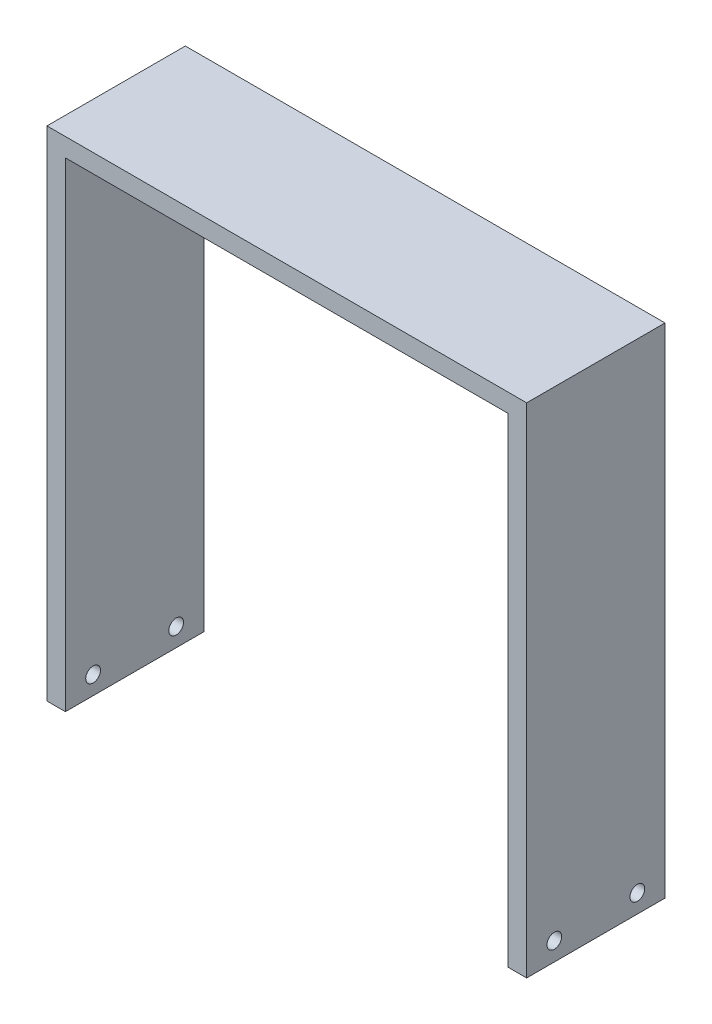
ISO-10303-21;
HEADER;
FILE_DESCRIPTION(('STEP AP214'),'2;1');
FILE_NAME('part.step','',(''),(''),'','','');
FILE_SCHEMA(('AUTOMOTIVE_DESIGN { 1 0 10303 214 1 1 1 1 }'));
ENDSEC;
DATA;
#1=APPLICATION_CONTEXT('core data for automotive mechanical design processes');
#2=APPLICATION_PROTOCOL_DEFINITION('international standard','automotive_design',2000,#1);
#3=PRODUCT_CONTEXT('',#1,'mechanical');
#4=PRODUCT('Part','Part','',(#3));
#5=PRODUCT_RELATED_PRODUCT_CATEGORY('part','',(#4));
#6=PRODUCT_DEFINITION_FORMATION('','',#4);
#7=PRODUCT_DEFINITION_CONTEXT('part definition',#1,'design');
#8=PRODUCT_DEFINITION('design','',#6,#7);
#9=PRODUCT_DEFINITION_SHAPE('','',#8);
#10=(LENGTH_UNIT() NAMED_UNIT(*) SI_UNIT(.MILLI.,.METRE.));
#11=(NAMED_UNIT(*) PLANE_ANGLE_UNIT() SI_UNIT($,.RADIAN.));
#12=(NAMED_UNIT(*) SI_UNIT($,.STERADIAN.) SOLID_ANGLE_UNIT());
#13=UNCERTAINTY_MEASURE_WITH_UNIT(LENGTH_MEASURE(1.E-05),#10,'distance_accuracy_value','');
#14=(GEOMETRIC_REPRESENTATION_CONTEXT(3) GLOBAL_UNCERTAINTY_ASSIGNED_CONTEXT((#13)) GLOBAL_UNIT_ASSIGNED_CONTEXT((#10,
#11,#12)) REPRESENTATION_CONTEXT('',''));
#15=CARTESIAN_POINT('',(0.,0.,0.));
#16=DIRECTION('',(0.,0.,1.));
#17=DIRECTION('',(1.,0.,0.));
#18=AXIS2_PLACEMENT_3D('',#15,#16,#17);
#19=CARTESIAN_POINT('',(52.,54.,15.));
#20=DIRECTION('',(-1.,0.,0.));
#21=DIRECTION('',(0.,-1.,0.));
#22=AXIS2_PLACEMENT_3D('',#19,#20,#21);
#23=PLANE('',#22);
#24=CARTESIAN_POINT('',(52.,2.00000000000001,12.));
#25=DIRECTION('',(1.,0.,0.));
#26=DIRECTION('',(0.,0.,-1.));
#27=AXIS2_PLACEMENT_3D('',#24,#25,#26);
#28=CIRCLE('',#27,0.799999999999994);
#29=CARTESIAN_POINT('',(52.,2.00000000000001,11.2));
#30=VERTEX_POINT('',#29);
#31=EDGE_CURVE('E181',#30,#30,#28,.T.);
#32=ORIENTED_EDGE('',*,*,#31,.F.);
#33=EDGE_LOOP('',(#32));
#34=FACE_BOUND('',#33,.T.);
#35=DIRECTION('',(0.,1.,0.));
#36=VECTOR('',#35,1.);
#37=CARTESIAN_POINT('',(52.,54.,0.));
#38=LINE('',#37,#36);
#39=CARTESIAN_POINT('',(52.,0.,0.));
#40=VERTEX_POINT('',#39);
#41=CARTESIAN_POINT('',(52.,54.,0.));
#42=VERTEX_POINT('',#41);
#43=EDGE_CURVE('E122',#40,#42,#38,.T.);
#44=ORIENTED_EDGE('',*,*,#43,.T.);
#45=DIRECTION('',(0.,0.,-1.));
#46=VECTOR('',#45,1.);
#47=CARTESIAN_POINT('',(52.,54.,15.));
#48=LINE('',#47,#46);
#49=CARTESIAN_POINT('',(52.,54.,15.));
#50=VERTEX_POINT('',#49);
#51=EDGE_CURVE('E119',#50,#42,#48,.T.);
#52=ORIENTED_EDGE('',*,*,#51,.F.);
#53=DIRECTION('',(0.,1.,0.));
#54=VECTOR('',#53,1.);
#55=CARTESIAN_POINT('',(52.,54.,15.));
#56=LINE('',#55,#54);
#57=CARTESIAN_POINT('',(52.,0.,15.));
#58=VERTEX_POINT('',#57);
#59=EDGE_CURVE('E108',#58,#50,#56,.T.);
#60=ORIENTED_EDGE('',*,*,#59,.F.);
#61=DIRECTION('',(0.,0.,-1.));
#62=VECTOR('',#61,1.);
#63=CARTESIAN_POINT('',(52.,0.,15.));
#64=LINE('',#63,#62);
#65=EDGE_CURVE('E123',#58,#40,#64,.T.);
#66=ORIENTED_EDGE('',*,*,#65,.T.);
#67=EDGE_LOOP('',(#44,#52,#60,#66));
#68=FACE_BOUND('',#67,.T.);
#69=CARTESIAN_POINT('',(52.,2.00000000000001,3.));
#70=DIRECTION('',(1.,0.,0.));
#71=DIRECTION('',(0.,0.,-1.));
#72=AXIS2_PLACEMENT_3D('',#69,#70,#71);
#73=CIRCLE('',#72,0.799999999999994);
#74=CARTESIAN_POINT('',(52.,2.00000000000001,2.20000000000001));
#75=VERTEX_POINT('',#74);
#76=EDGE_CURVE('E187',#75,#75,#73,.T.);
#77=ORIENTED_EDGE('',*,*,#76,.F.);
#78=EDGE_LOOP('',(#77));
#79=FACE_BOUND('',#78,.T.);
#80=ADVANCED_FACE('F35',(#34,#68,#79),#23,.F.);
#81=CARTESIAN_POINT('',(50.,0.,15.));
#82=DIRECTION('',(1.,0.,0.));
#83=DIRECTION('',(0.,0.,-1.));
#84=AXIS2_PLACEMENT_3D('',#81,#82,#83);
#85=PLANE('',#84);
#86=CARTESIAN_POINT('',(50.,2.00000000000001,3.));
#87=DIRECTION('',(1.,0.,0.));
#88=DIRECTION('',(0.,0.,-1.));
#89=AXIS2_PLACEMENT_3D('',#86,#87,#88);
#90=CIRCLE('',#89,0.799999999999997);
#91=CARTESIAN_POINT('',(50.,2.00000000000001,2.2));
#92=VERTEX_POINT('',#91);
#93=EDGE_CURVE('E184',#92,#92,#90,.F.);
#94=ORIENTED_EDGE('',*,*,#93,.F.);
#95=EDGE_LOOP('',(#94));
#96=FACE_BOUND('',#95,.T.);
#97=DIRECTION('',(0.,-1.,0.));
#98=VECTOR('',#97,1.);
#99=CARTESIAN_POINT('',(50.,0.,0.));
#100=LINE('',#99,#98);
#101=CARTESIAN_POINT('',(50.,52.,0.));
#102=VERTEX_POINT('',#101);
#103=CARTESIAN_POINT('',(50.,0.,0.));
#104=VERTEX_POINT('',#103);
#105=EDGE_CURVE('E140',#102,#104,#100,.T.);
#106=ORIENTED_EDGE('',*,*,#105,.T.);
#107=DIRECTION('',(0.,0.,-1.));
#108=VECTOR('',#107,1.);
#109=CARTESIAN_POINT('',(50.,0.,15.));
#110=LINE('',#109,#108);
#111=CARTESIAN_POINT('',(50.,0.,15.));
#112=VERTEX_POINT('',#111);
#113=EDGE_CURVE('E151',#112,#104,#110,.T.);
#114=ORIENTED_EDGE('',*,*,#113,.F.);
#115=DIRECTION('',(0.,-1.,0.));
#116=VECTOR('',#115,1.);
#117=CARTESIAN_POINT('',(50.,0.,15.));
#118=LINE('',#117,#116);
#119=CARTESIAN_POINT('',(50.,52.,15.));
#120=VERTEX_POINT('',#119);
#121=EDGE_CURVE('E175',#120,#112,#118,.T.);
#122=ORIENTED_EDGE('',*,*,#121,.F.);
#123=DIRECTION('',(0.,0.,-1.));
#124=VECTOR('',#123,1.);
#125=CARTESIAN_POINT('',(50.,52.,15.));
#126=LINE('',#125,#124);
#127=EDGE_CURVE('E154',#120,#102,#126,.T.);
#128=ORIENTED_EDGE('',*,*,#127,.T.);
#129=EDGE_LOOP('',(#106,#114,#122,#128));
#130=FACE_BOUND('',#129,.T.);
#131=CARTESIAN_POINT('',(50.,2.00000000000001,12.));
#132=DIRECTION('',(1.,0.,0.));
#133=DIRECTION('',(0.,0.,-1.));
#134=AXIS2_PLACEMENT_3D('',#131,#132,#133);
#135=CIRCLE('',#134,0.799999999999994);
#136=CARTESIAN_POINT('',(50.,2.00000000000001,11.2));
#137=VERTEX_POINT('',#136);
#138=EDGE_CURVE('E136',#137,#137,#135,.F.);
#139=ORIENTED_EDGE('',*,*,#138,.F.);
#140=EDGE_LOOP('',(#139));
#141=FACE_BOUND('',#140,.T.);
#142=ADVANCED_FACE('F170',(#96,#130,#141),#85,.F.);
#143=CARTESIAN_POINT('',(2.,0.,15.));
#144=DIRECTION('',(0.,1.,0.));
#145=DIRECTION('',(-1.,0.,0.));
#146=AXIS2_PLACEMENT_3D('',#143,#144,#145);
#147=PLANE('',#146);
#148=DIRECTION('',(1.,0.,0.));
#149=VECTOR('',#148,1.);
#150=CARTESIAN_POINT('',(2.,0.,0.));
#151=LINE('',#150,#149);
#152=CARTESIAN_POINT('',(0.,0.,0.));
#153=VERTEX_POINT('',#152);
#154=CARTESIAN_POINT('',(2.,0.,0.));
#155=VERTEX_POINT('',#154);
#156=EDGE_CURVE('E132',#153,#155,#151,.T.);
#157=ORIENTED_EDGE('',*,*,#156,.T.);
#158=DIRECTION('',(0.,0.,-1.));
#159=VECTOR('',#158,1.);
#160=CARTESIAN_POINT('',(2.,0.,15.));
#161=LINE('',#160,#159);
#162=CARTESIAN_POINT('',(2.,0.,15.));
#163=VERTEX_POINT('',#162);
#164=EDGE_CURVE('E11',#163,#155,#161,.T.);
#165=ORIENTED_EDGE('',*,*,#164,.F.);
#166=DIRECTION('',(1.,0.,0.));
#167=VECTOR('',#166,1.);
#168=CARTESIAN_POINT('',(2.,0.,15.));
#169=LINE('',#168,#167);
#170=CARTESIAN_POINT('',(0.,0.,15.));
#171=VERTEX_POINT('',#170);
#172=EDGE_CURVE('E147',#171,#163,#169,.T.);
#173=ORIENTED_EDGE('',*,*,#172,.F.);
#174=DIRECTION('',(0.,0.,-1.));
#175=VECTOR('',#174,1.);
#176=CARTESIAN_POINT('',(0.,0.,15.));
#177=LINE('',#176,#175);
#178=EDGE_CURVE('E128',#171,#153,#177,.T.);
#179=ORIENTED_EDGE('',*,*,#178,.T.);
#180=EDGE_LOOP('',(#157,#165,#173,#179));
#181=FACE_BOUND('',#180,.T.);
#182=ADVANCED_FACE('F37',(#181),#147,.F.);
#183=CARTESIAN_POINT('',(2.,52.,15.));
#184=DIRECTION('',(-1.,0.,0.));
#185=DIRECTION('',(0.,-1.,0.));
#186=AXIS2_PLACEMENT_3D('',#183,#184,#185);
#187=PLANE('',#186);
#188=CARTESIAN_POINT('',(2.,2.,12.));
#189=DIRECTION('',(-1.,0.,0.));
#190=DIRECTION('',(0.,-1.,0.));
#191=AXIS2_PLACEMENT_3D('',#188,#189,#190);
#192=CIRCLE('',#191,0.799999999999991);
#193=CARTESIAN_POINT('',(2.,1.20000000000001,12.));
#194=VERTEX_POINT('',#193);
#195=EDGE_CURVE('E198',#194,#194,#192,.T.);
#196=ORIENTED_EDGE('',*,*,#195,.T.);
#197=EDGE_LOOP('',(#196));
#198=FACE_BOUND('',#197,.T.);
#199=CARTESIAN_POINT('',(2.,2.,3.));
#200=DIRECTION('',(-1.,0.,0.));
#201=DIRECTION('',(0.,-1.,0.));
#202=AXIS2_PLACEMENT_3D('',#199,#200,#201);
#203=CIRCLE('',#202,0.799999999999994);
#204=CARTESIAN_POINT('',(2.,1.20000000000001,3.));
#205=VERTEX_POINT('',#204);
#206=EDGE_CURVE('E190',#205,#205,#203,.T.);
#207=ORIENTED_EDGE('',*,*,#206,.T.);
#208=EDGE_LOOP('',(#207));
#209=FACE_BOUND('',#208,.T.);
#210=DIRECTION('',(0.,1.,0.));
#211=VECTOR('',#210,1.);
#212=CARTESIAN_POINT('',(2.,52.,0.));
#213=LINE('',#212,#211);
#214=CARTESIAN_POINT('',(2.,52.,0.));
#215=VERTEX_POINT('',#214);
#216=EDGE_CURVE('E135',#155,#215,#213,.T.);
#217=ORIENTED_EDGE('',*,*,#216,.T.);
#218=DIRECTION('',(0.,0.,-1.));
#219=VECTOR('',#218,1.);
#220=CARTESIAN_POINT('',(2.,52.,15.));
#221=LINE('',#220,#219);
#222=CARTESIAN_POINT('',(2.,52.,15.));
#223=VERTEX_POINT('',#222);
#224=EDGE_CURVE('E44',#223,#215,#221,.T.);
#225=ORIENTED_EDGE('',*,*,#224,.F.);
#226=DIRECTION('',(0.,1.,0.));
#227=VECTOR('',#226,1.);
#228=CARTESIAN_POINT('',(2.,52.,15.));
#229=LINE('',#228,#227);
#230=EDGE_CURVE('E95',#163,#223,#229,.T.);
#231=ORIENTED_EDGE('',*,*,#230,.F.);
#232=ORIENTED_EDGE('',*,*,#164,.T.);
#233=EDGE_LOOP('',(#217,#225,#231,#232));
#234=FACE_BOUND('',#233,.T.);
#235=ADVANCED_FACE('F221',(#198,#209,#234),#187,.F.);
#236=CARTESIAN_POINT('',(50.,52.,15.));
#237=DIRECTION('',(0.,1.,0.));
#238=DIRECTION('',(-1.,0.,0.));
#239=AXIS2_PLACEMENT_3D('',#236,#237,#238);
#240=PLANE('',#239);
#241=DIRECTION('',(1.,0.,0.));
#242=VECTOR('',#241,1.);
#243=CARTESIAN_POINT('',(50.,52.,0.));
#244=LINE('',#243,#242);
#245=EDGE_CURVE('E138',#215,#102,#244,.T.);
#246=ORIENTED_EDGE('',*,*,#245,.T.);
#247=ORIENTED_EDGE('',*,*,#127,.F.);
#248=DIRECTION('',(1.,0.,0.));
#249=VECTOR('',#248,1.);
#250=CARTESIAN_POINT('',(50.,52.,15.));
#251=LINE('',#250,#249);
#252=EDGE_CURVE('E162',#223,#120,#251,.T.);
#253=ORIENTED_EDGE('',*,*,#252,.F.);
#254=ORIENTED_EDGE('',*,*,#224,.T.);
#255=EDGE_LOOP('',(#246,#247,#253,#254));
#256=FACE_BOUND('',#255,.T.);
#257=ADVANCED_FACE('F160',(#256),#240,.F.);
#258=CARTESIAN_POINT('',(52.,0.,15.));
#259=DIRECTION('',(0.,1.,0.));
#260=DIRECTION('',(0.,0.,1.));
#261=AXIS2_PLACEMENT_3D('',#258,#259,#260);
#262=PLANE('',#261);
#263=DIRECTION('',(1.,0.,0.));
#264=VECTOR('',#263,1.);
#265=CARTESIAN_POINT('',(52.,0.,0.));
#266=LINE('',#265,#264);
#267=EDGE_CURVE('E142',#104,#40,#266,.T.);
#268=ORIENTED_EDGE('',*,*,#267,.T.);
#269=ORIENTED_EDGE('',*,*,#65,.F.);
#270=DIRECTION('',(1.,0.,0.));
#271=VECTOR('',#270,1.);
#272=CARTESIAN_POINT('',(52.,0.,15.));
#273=LINE('',#272,#271);
#274=EDGE_CURVE('E114',#112,#58,#273,.T.);
#275=ORIENTED_EDGE('',*,*,#274,.F.);
#276=ORIENTED_EDGE('',*,*,#113,.T.);
#277=EDGE_LOOP('',(#268,#269,#275,#276));
#278=FACE_BOUND('',#277,.T.);
#279=ADVANCED_FACE('F174',(#278),#262,.F.);
#280=CARTESIAN_POINT('',(0.,54.,15.));
#281=DIRECTION('',(0.,-1.,0.));
#282=DIRECTION('',(0.,0.,-1.));
#283=AXIS2_PLACEMENT_3D('',#280,#281,#282);
#284=PLANE('',#283);
#285=DIRECTION('',(-1.,0.,0.));
#286=VECTOR('',#285,1.);
#287=CARTESIAN_POINT('',(0.,54.,0.));
#288=LINE('',#287,#286);
#289=CARTESIAN_POINT('',(0.,54.,0.));
#290=VERTEX_POINT('',#289);
#291=EDGE_CURVE('E81',#42,#290,#288,.T.);
#292=ORIENTED_EDGE('',*,*,#291,.T.);
#293=DIRECTION('',(0.,0.,-1.));
#294=VECTOR('',#293,1.);
#295=CARTESIAN_POINT('',(0.,54.,15.));
#296=LINE('',#295,#294);
#297=CARTESIAN_POINT('',(0.,54.,15.));
#298=VERTEX_POINT('',#297);
#299=EDGE_CURVE('E124',#298,#290,#296,.T.);
#300=ORIENTED_EDGE('',*,*,#299,.F.);
#301=DIRECTION('',(-1.,0.,0.));
#302=VECTOR('',#301,1.);
#303=CARTESIAN_POINT('',(0.,54.,15.));
#304=LINE('',#303,#302);
#305=EDGE_CURVE('E112',#50,#298,#304,.T.);
#306=ORIENTED_EDGE('',*,*,#305,.F.);
#307=ORIENTED_EDGE('',*,*,#51,.T.);
#308=EDGE_LOOP('',(#292,#300,#306,#307));
#309=FACE_BOUND('',#308,.T.);
#310=ADVANCED_FACE('F126',(#309),#284,.F.);
#311=CARTESIAN_POINT('',(0.,0.,15.));
#312=DIRECTION('',(1.,0.,0.));
#313=DIRECTION('',(0.,0.,-1.));
#314=AXIS2_PLACEMENT_3D('',#311,#312,#313);
#315=PLANE('',#314);
#316=CARTESIAN_POINT('',(0.,2.,12.));
#317=DIRECTION('',(-1.,0.,0.));
#318=DIRECTION('',(0.,0.,1.));
#319=AXIS2_PLACEMENT_3D('',#316,#317,#318);
#320=CIRCLE('',#319,0.799999999999994);
#321=CARTESIAN_POINT('',(0.,2.,12.8));
#322=VERTEX_POINT('',#321);
#323=EDGE_CURVE('E201',#322,#322,#320,.T.);
#324=ORIENTED_EDGE('',*,*,#323,.F.);
#325=EDGE_LOOP('',(#324));
#326=FACE_BOUND('',#325,.T.);
#327=CARTESIAN_POINT('',(0.,2.,3.));
#328=DIRECTION('',(-1.,0.,0.));
#329=DIRECTION('',(0.,0.,1.));
#330=AXIS2_PLACEMENT_3D('',#327,#328,#329);
#331=CIRCLE('',#330,0.799999999999994);
#332=CARTESIAN_POINT('',(0.,2.,3.79999999999999));
#333=VERTEX_POINT('',#332);
#334=EDGE_CURVE('E195',#333,#333,#331,.T.);
#335=ORIENTED_EDGE('',*,*,#334,.F.);
#336=EDGE_LOOP('',(#335));
#337=FACE_BOUND('',#336,.T.);
#338=DIRECTION('',(0.,-1.,0.));
#339=VECTOR('',#338,1.);
#340=CARTESIAN_POINT('',(0.,0.,0.));
#341=LINE('',#340,#339);
#342=EDGE_CURVE('E87',#290,#153,#341,.T.);
#343=ORIENTED_EDGE('',*,*,#342,.T.);
#344=ORIENTED_EDGE('',*,*,#178,.F.);
#345=DIRECTION('',(0.,-1.,0.));
#346=VECTOR('',#345,1.);
#347=CARTESIAN_POINT('',(0.,0.,15.));
#348=LINE('',#347,#346);
#349=EDGE_CURVE('E52',#298,#171,#348,.T.);
#350=ORIENTED_EDGE('',*,*,#349,.F.);
#351=ORIENTED_EDGE('',*,*,#299,.T.);
#352=EDGE_LOOP('',(#343,#344,#350,#351));
#353=FACE_BOUND('',#352,.T.);
#354=ADVANCED_FACE('F208',(#326,#337,#353),#315,.F.);
#355=CARTESIAN_POINT('',(0.,0.,15.));
#356=DIRECTION('',(0.,0.,-1.));
#357=DIRECTION('',(-1.,0.,0.));
#358=AXIS2_PLACEMENT_3D('',#355,#356,#357);
#359=PLANE('',#358);
#360=ORIENTED_EDGE('',*,*,#172,.T.);
#361=ORIENTED_EDGE('',*,*,#230,.T.);
#362=ORIENTED_EDGE('',*,*,#252,.T.);
#363=ORIENTED_EDGE('',*,*,#121,.T.);
#364=ORIENTED_EDGE('',*,*,#274,.T.);
#365=ORIENTED_EDGE('',*,*,#59,.T.);
#366=ORIENTED_EDGE('',*,*,#305,.T.);
#367=ORIENTED_EDGE('',*,*,#349,.T.);
#368=EDGE_LOOP('',(#360,#361,#362,#363,#364,#365,#366,#367));
#369=FACE_BOUND('',#368,.T.);
#370=ADVANCED_FACE('F110',(#369),#359,.F.);
#371=CARTESIAN_POINT('',(0.,0.,0.));
#372=DIRECTION('',(0.,0.,-1.));
#373=DIRECTION('',(-1.,0.,0.));
#374=AXIS2_PLACEMENT_3D('',#371,#372,#373);
#375=PLANE('',#374);
#376=ORIENTED_EDGE('',*,*,#156,.F.);
#377=ORIENTED_EDGE('',*,*,#342,.F.);
#378=ORIENTED_EDGE('',*,*,#291,.F.);
#379=ORIENTED_EDGE('',*,*,#43,.F.);
#380=ORIENTED_EDGE('',*,*,#267,.F.);
#381=ORIENTED_EDGE('',*,*,#105,.F.);
#382=ORIENTED_EDGE('',*,*,#245,.F.);
#383=ORIENTED_EDGE('',*,*,#216,.F.);
#384=EDGE_LOOP('',(#376,#377,#378,#379,#380,#381,#382,#383));
#385=FACE_BOUND('',#384,.T.);
#386=ADVANCED_FACE('F166',(#385),#375,.T.);
#387=CARTESIAN_POINT('',(52.,2.00000000000001,12.));
#388=DIRECTION('',(1.,0.,0.));
#389=DIRECTION('',(0.,0.,-1.));
#390=AXIS2_PLACEMENT_3D('',#387,#388,#389);
#391=CYLINDRICAL_SURFACE('',#390,0.799999999999994);
#392=ORIENTED_EDGE('',*,*,#138,.T.);
#393=EDGE_LOOP('',(#392));
#394=FACE_BOUND('',#393,.T.);
#395=ORIENTED_EDGE('',*,*,#31,.T.);
#396=EDGE_LOOP('',(#395));
#397=FACE_BOUND('',#396,.T.);
#398=ADVANCED_FACE('F274',(#394,#397),#391,.F.);
#399=CARTESIAN_POINT('',(52.,2.00000000000001,3.));
#400=DIRECTION('',(1.,0.,0.));
#401=DIRECTION('',(0.,0.,-1.));
#402=AXIS2_PLACEMENT_3D('',#399,#400,#401);
#403=CYLINDRICAL_SURFACE('',#402,0.799999999999997);
#404=ORIENTED_EDGE('',*,*,#93,.T.);
#405=EDGE_LOOP('',(#404));
#406=FACE_BOUND('',#405,.T.);
#407=ORIENTED_EDGE('',*,*,#76,.T.);
#408=EDGE_LOOP('',(#407));
#409=FACE_BOUND('',#408,.T.);
#410=ADVANCED_FACE('F217',(#406,#409),#403,.F.);
#411=CARTESIAN_POINT('',(0.,2.,3.));
#412=DIRECTION('',(-1.,0.,0.));
#413=DIRECTION('',(0.,0.,1.));
#414=AXIS2_PLACEMENT_3D('',#411,#412,#413);
#415=CYLINDRICAL_SURFACE('',#414,0.799999999999994);
#416=ORIENTED_EDGE('',*,*,#334,.T.);
#417=EDGE_LOOP('',(#416));
#418=FACE_BOUND('',#417,.T.);
#419=ORIENTED_EDGE('',*,*,#206,.F.);
#420=EDGE_LOOP('',(#419));
#421=FACE_BOUND('',#420,.T.);
#422=ADVANCED_FACE('F214',(#418,#421),#415,.F.);
#423=CARTESIAN_POINT('',(0.,2.,12.));
#424=DIRECTION('',(-1.,0.,0.));
#425=DIRECTION('',(0.,0.,1.));
#426=AXIS2_PLACEMENT_3D('',#423,#424,#425);
#427=CYLINDRICAL_SURFACE('',#426,0.799999999999991);
#428=ORIENTED_EDGE('',*,*,#323,.T.);
#429=EDGE_LOOP('',(#428));
#430=FACE_BOUND('',#429,.T.);
#431=ORIENTED_EDGE('',*,*,#195,.F.);
#432=EDGE_LOOP('',(#431));
#433=FACE_BOUND('',#432,.T.);
#434=ADVANCED_FACE('F205',(#430,#433),#427,.F.);
#435=CLOSED_SHELL('',(#80,#142,#182,#235,#257,#279,#310,#354,#370,#386,#398,#410,#422,#434));
#436=MANIFOLD_SOLID_BREP('B2',#435);
#437=ADVANCED_BREP_SHAPE_REPRESENTATION('',(#18,#436),#14);
#438=SHAPE_DEFINITION_REPRESENTATION(#9,#437);
ENDSEC;
END-ISO-10303-21;
